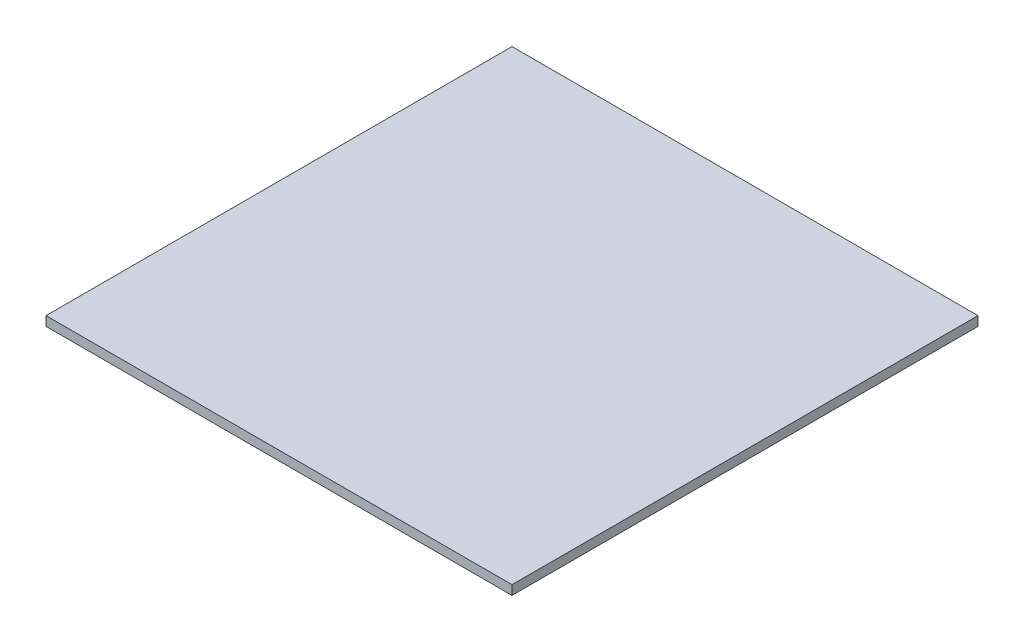
ISO-10303-21;
HEADER;
FILE_DESCRIPTION(('STEP AP214'),'2;1');
FILE_NAME('part.step','',(''),(''),'','','');
FILE_SCHEMA(('AUTOMOTIVE_DESIGN { 1 0 10303 214 1 1 1 1 }'));
ENDSEC;
DATA;
#1=APPLICATION_CONTEXT('core data for automotive mechanical design processes');
#2=APPLICATION_PROTOCOL_DEFINITION('international standard','automotive_design',2000,#1);
#3=PRODUCT_CONTEXT('',#1,'mechanical');
#4=PRODUCT('Part','Part','',(#3));
#5=PRODUCT_RELATED_PRODUCT_CATEGORY('part','',(#4));
#6=PRODUCT_DEFINITION_FORMATION('','',#4);
#7=PRODUCT_DEFINITION_CONTEXT('part definition',#1,'design');
#8=PRODUCT_DEFINITION('design','',#6,#7);
#9=PRODUCT_DEFINITION_SHAPE('','',#8);
#10=(LENGTH_UNIT() NAMED_UNIT(*) SI_UNIT(.MILLI.,.METRE.));
#11=(NAMED_UNIT(*) PLANE_ANGLE_UNIT() SI_UNIT($,.RADIAN.));
#12=(NAMED_UNIT(*) SI_UNIT($,.STERADIAN.) SOLID_ANGLE_UNIT());
#13=UNCERTAINTY_MEASURE_WITH_UNIT(LENGTH_MEASURE(1.E-05),#10,'distance_accuracy_value','');
#14=(GEOMETRIC_REPRESENTATION_CONTEXT(3) GLOBAL_UNCERTAINTY_ASSIGNED_CONTEXT((#13)) GLOBAL_UNIT_ASSIGNED_CONTEXT((#10,
#11,#12)) REPRESENTATION_CONTEXT('',''));
#15=CARTESIAN_POINT('',(0.,0.,0.));
#16=DIRECTION('',(0.,0.,1.));
#17=DIRECTION('',(1.,0.,0.));
#18=AXIS2_PLACEMENT_3D('',#15,#16,#17);
#19=CARTESIAN_POINT('',(-88.3570618564527,10.,-436.634010598925));
#20=DIRECTION('',(1.,0.,0.));
#21=DIRECTION('',(0.,0.,-1.));
#22=AXIS2_PLACEMENT_3D('',#19,#20,#21);
#23=PLANE('',#22);
#24=DIRECTION('',(0.,0.,1.));
#25=VECTOR('',#24,1.);
#26=CARTESIAN_POINT('',(-88.3570618564527,0.,-436.634010598925));
#27=LINE('',#26,#25);
#28=CARTESIAN_POINT('',(-88.3570618564527,0.,-436.634010598925));
#29=VERTEX_POINT('',#28);
#30=CARTESIAN_POINT('',(-88.3570618564526,0.,63.3659894010753));
#31=VERTEX_POINT('',#30);
#32=EDGE_CURVE('E104',#29,#31,#27,.T.);
#33=ORIENTED_EDGE('',*,*,#32,.T.);
#34=DIRECTION('',(0.,-1.,0.));
#35=VECTOR('',#34,1.);
#36=CARTESIAN_POINT('',(-88.3570618564526,10.,63.3659894010753));
#37=LINE('',#36,#35);
#38=CARTESIAN_POINT('',(-88.3570618564526,10.,63.3659894010753));
#39=VERTEX_POINT('',#38);
#40=EDGE_CURVE('E11',#39,#31,#37,.T.);
#41=ORIENTED_EDGE('',*,*,#40,.F.);
#42=DIRECTION('',(0.,0.,1.));
#43=VECTOR('',#42,1.);
#44=CARTESIAN_POINT('',(-88.3570618564527,10.,-436.634010598925));
#45=LINE('',#44,#43);
#46=CARTESIAN_POINT('',(-88.3570618564527,10.,-436.634010598925));
#47=VERTEX_POINT('',#46);
#48=EDGE_CURVE('E92',#47,#39,#45,.T.);
#49=ORIENTED_EDGE('',*,*,#48,.F.);
#50=DIRECTION('',(0.,-1.,0.));
#51=VECTOR('',#50,1.);
#52=CARTESIAN_POINT('',(-88.3570618564527,10.,-436.634010598925));
#53=LINE('',#52,#51);
#54=EDGE_CURVE('E100',#47,#29,#53,.T.);
#55=ORIENTED_EDGE('',*,*,#54,.T.);
#56=EDGE_LOOP('',(#33,#41,#49,#55));
#57=FACE_BOUND('',#56,.T.);
#58=ADVANCED_FACE('F41',(#57),#23,.F.);
#59=CARTESIAN_POINT('',(-88.3570618564526,10.,63.3659894010753));
#60=DIRECTION('',(0.,0.,-1.));
#61=DIRECTION('',(-1.,0.,0.));
#62=AXIS2_PLACEMENT_3D('',#59,#60,#61);
#63=PLANE('',#62);
#64=DIRECTION('',(1.,0.,0.));
#65=VECTOR('',#64,1.);
#66=CARTESIAN_POINT('',(-88.3570618564526,0.,63.3659894010753));
#67=LINE('',#66,#65);
#68=CARTESIAN_POINT('',(411.642938143547,0.,63.3659894010753));
#69=VERTEX_POINT('',#68);
#70=EDGE_CURVE('E96',#31,#69,#67,.T.);
#71=ORIENTED_EDGE('',*,*,#70,.T.);
#72=DIRECTION('',(0.,-1.,0.));
#73=VECTOR('',#72,1.);
#74=CARTESIAN_POINT('',(411.642938143547,10.,63.3659894010753));
#75=LINE('',#74,#73);
#76=CARTESIAN_POINT('',(411.642938143547,10.,63.3659894010753));
#77=VERTEX_POINT('',#76);
#78=EDGE_CURVE('E49',#77,#69,#75,.T.);
#79=ORIENTED_EDGE('',*,*,#78,.F.);
#80=DIRECTION('',(1.,0.,0.));
#81=VECTOR('',#80,1.);
#82=CARTESIAN_POINT('',(-88.3570618564526,10.,63.3659894010753));
#83=LINE('',#82,#81);
#84=EDGE_CURVE('E87',#39,#77,#83,.T.);
#85=ORIENTED_EDGE('',*,*,#84,.F.);
#86=ORIENTED_EDGE('',*,*,#40,.T.);
#87=EDGE_LOOP('',(#71,#79,#85,#86));
#88=FACE_BOUND('',#87,.T.);
#89=ADVANCED_FACE('F95',(#88),#63,.F.);
#90=CARTESIAN_POINT('',(411.642938143547,10.,-436.634010598925));
#91=DIRECTION('',(-1.,0.,0.));
#92=DIRECTION('',(0.,0.,1.));
#93=AXIS2_PLACEMENT_3D('',#90,#91,#92);
#94=PLANE('',#93);
#95=DIRECTION('',(0.,0.,-1.));
#96=VECTOR('',#95,1.);
#97=CARTESIAN_POINT('',(411.642938143547,0.,-436.634010598925));
#98=LINE('',#97,#96);
#99=CARTESIAN_POINT('',(411.642938143547,0.,-436.634010598925));
#100=VERTEX_POINT('',#99);
#101=EDGE_CURVE('E74',#69,#100,#98,.T.);
#102=ORIENTED_EDGE('',*,*,#101,.T.);
#103=DIRECTION('',(0.,-1.,0.));
#104=VECTOR('',#103,1.);
#105=CARTESIAN_POINT('',(411.642938143547,10.,-436.634010598925));
#106=LINE('',#105,#104);
#107=CARTESIAN_POINT('',(411.642938143547,10.,-436.634010598925));
#108=VERTEX_POINT('',#107);
#109=EDGE_CURVE('E97',#108,#100,#106,.T.);
#110=ORIENTED_EDGE('',*,*,#109,.F.);
#111=DIRECTION('',(0.,0.,-1.));
#112=VECTOR('',#111,1.);
#113=CARTESIAN_POINT('',(411.642938143547,10.,-436.634010598925));
#114=LINE('',#113,#112);
#115=EDGE_CURVE('E90',#77,#108,#114,.T.);
#116=ORIENTED_EDGE('',*,*,#115,.F.);
#117=ORIENTED_EDGE('',*,*,#78,.T.);
#118=EDGE_LOOP('',(#102,#110,#116,#117));
#119=FACE_BOUND('',#118,.T.);
#120=ADVANCED_FACE('F98',(#119),#94,.F.);
#121=CARTESIAN_POINT('',(-88.3570618564527,10.,-436.634010598925));
#122=DIRECTION('',(0.,0.,1.));
#123=DIRECTION('',(1.,0.,0.));
#124=AXIS2_PLACEMENT_3D('',#121,#122,#123);
#125=PLANE('',#124);
#126=DIRECTION('',(-1.,0.,0.));
#127=VECTOR('',#126,1.);
#128=CARTESIAN_POINT('',(-88.3570618564527,0.,-436.634010598925));
#129=LINE('',#128,#127);
#130=EDGE_CURVE('E80',#100,#29,#129,.T.);
#131=ORIENTED_EDGE('',*,*,#130,.T.);
#132=ORIENTED_EDGE('',*,*,#54,.F.);
#133=DIRECTION('',(-1.,0.,0.));
#134=VECTOR('',#133,1.);
#135=CARTESIAN_POINT('',(-88.3570618564527,10.,-436.634010598925));
#136=LINE('',#135,#134);
#137=EDGE_CURVE('E57',#108,#47,#136,.T.);
#138=ORIENTED_EDGE('',*,*,#137,.F.);
#139=ORIENTED_EDGE('',*,*,#109,.T.);
#140=EDGE_LOOP('',(#131,#132,#138,#139));
#141=FACE_BOUND('',#140,.T.);
#142=ADVANCED_FACE('F111',(#141),#125,.F.);
#143=CARTESIAN_POINT('',(0.,10.,0.));
#144=DIRECTION('',(0.,1.,0.));
#145=DIRECTION('',(0.,0.,1.));
#146=AXIS2_PLACEMENT_3D('',#143,#144,#145);
#147=PLANE('',#146);
#148=ORIENTED_EDGE('',*,*,#48,.T.);
#149=ORIENTED_EDGE('',*,*,#84,.T.);
#150=ORIENTED_EDGE('',*,*,#115,.T.);
#151=ORIENTED_EDGE('',*,*,#137,.T.);
#152=EDGE_LOOP('',(#148,#149,#150,#151));
#153=FACE_BOUND('',#152,.T.);
#154=ADVANCED_FACE('F88',(#153),#147,.T.);
#155=CARTESIAN_POINT('',(0.,0.,0.));
#156=DIRECTION('',(0.,1.,0.));
#157=DIRECTION('',(0.,0.,1.));
#158=AXIS2_PLACEMENT_3D('',#155,#156,#157);
#159=PLANE('',#158);
#160=ORIENTED_EDGE('',*,*,#32,.F.);
#161=ORIENTED_EDGE('',*,*,#130,.F.);
#162=ORIENTED_EDGE('',*,*,#101,.F.);
#163=ORIENTED_EDGE('',*,*,#70,.F.);
#164=EDGE_LOOP('',(#160,#161,#162,#163));
#165=FACE_BOUND('',#164,.T.);
#166=ADVANCED_FACE('F114',(#165),#159,.F.);
#167=CLOSED_SHELL('',(#58,#89,#120,#142,#154,#166));
#168=MANIFOLD_SOLID_BREP('B2',#167);
#169=ADVANCED_BREP_SHAPE_REPRESENTATION('',(#18,#168),#14);
#170=SHAPE_DEFINITION_REPRESENTATION(#9,#169);
ENDSEC;
END-ISO-10303-21;
